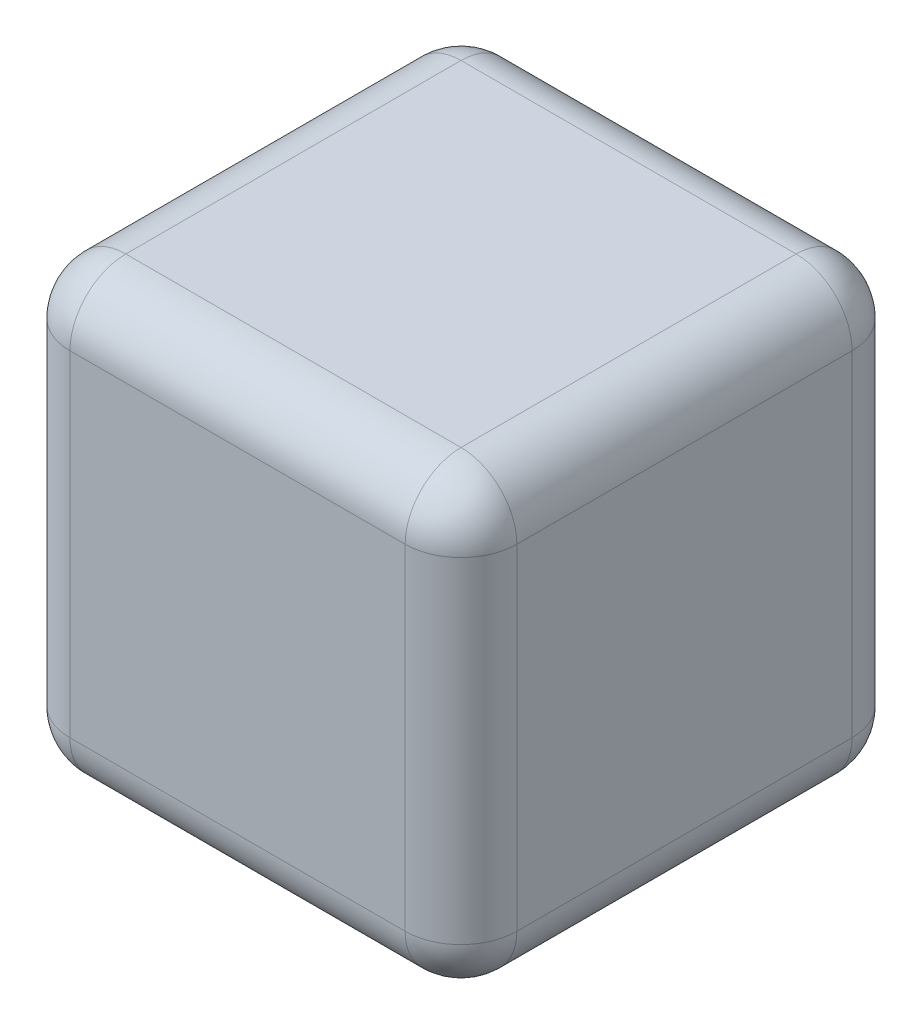
ISO-10303-21;
HEADER;
FILE_DESCRIPTION(('STEP AP214'),'2;1');
FILE_NAME('part.step','',(''),(''),'','','');
FILE_SCHEMA(('AUTOMOTIVE_DESIGN { 1 0 10303 214 1 1 1 1 }'));
ENDSEC;
DATA;
#1=APPLICATION_CONTEXT('core data for automotive mechanical design processes');
#2=APPLICATION_PROTOCOL_DEFINITION('international standard','automotive_design',2000,#1);
#3=PRODUCT_CONTEXT('',#1,'mechanical');
#4=PRODUCT('Part','Part','',(#3));
#5=PRODUCT_RELATED_PRODUCT_CATEGORY('part','',(#4));
#6=PRODUCT_DEFINITION_FORMATION('','',#4);
#7=PRODUCT_DEFINITION_CONTEXT('part definition',#1,'design');
#8=PRODUCT_DEFINITION('design','',#6,#7);
#9=PRODUCT_DEFINITION_SHAPE('','',#8);
#10=(LENGTH_UNIT() NAMED_UNIT(*) SI_UNIT(.MILLI.,.METRE.));
#11=(NAMED_UNIT(*) PLANE_ANGLE_UNIT() SI_UNIT($,.RADIAN.));
#12=(NAMED_UNIT(*) SI_UNIT($,.STERADIAN.) SOLID_ANGLE_UNIT());
#13=UNCERTAINTY_MEASURE_WITH_UNIT(LENGTH_MEASURE(1.E-05),#10,'distance_accuracy_value','');
#14=(GEOMETRIC_REPRESENTATION_CONTEXT(3) GLOBAL_UNCERTAINTY_ASSIGNED_CONTEXT((#13)) GLOBAL_UNIT_ASSIGNED_CONTEXT((#10,
#11,#12)) REPRESENTATION_CONTEXT('',''));
#15=CARTESIAN_POINT('',(0.,0.,0.));
#16=DIRECTION('',(0.,0.,1.));
#17=DIRECTION('',(1.,0.,0.));
#18=AXIS2_PLACEMENT_3D('',#15,#16,#17);
#19=CARTESIAN_POINT('',(40.,80.,-40.));
#20=DIRECTION('',(-1.,0.,0.));
#21=DIRECTION('',(0.,0.,1.));
#22=AXIS2_PLACEMENT_3D('',#19,#20,#21);
#23=PLANE('',#22);
#24=DIRECTION('',(0.,-1.,0.));
#25=VECTOR('',#24,1.);
#26=CARTESIAN_POINT('',(40.,80.,-30.));
#27=LINE('',#26,#25);
#28=CARTESIAN_POINT('',(40.,9.99999999999999,-30.));
#29=VERTEX_POINT('',#28);
#30=CARTESIAN_POINT('',(40.,70.,-30.));
#31=VERTEX_POINT('',#30);
#32=EDGE_CURVE('E262',#29,#31,#27,.F.);
#33=ORIENTED_EDGE('',*,*,#32,.T.);
#34=DIRECTION('',(0.,0.,-1.));
#35=VECTOR('',#34,1.);
#36=CARTESIAN_POINT('',(40.,70.,40.));
#37=LINE('',#36,#35);
#38=CARTESIAN_POINT('',(40.,70.,30.));
#39=VERTEX_POINT('',#38);
#40=EDGE_CURVE('E264',#31,#39,#37,.F.);
#41=ORIENTED_EDGE('',*,*,#40,.T.);
#42=DIRECTION('',(0.,-1.,0.));
#43=VECTOR('',#42,1.);
#44=CARTESIAN_POINT('',(40.,80.,30.));
#45=LINE('',#44,#43);
#46=CARTESIAN_POINT('',(40.,9.99999999999999,30.));
#47=VERTEX_POINT('',#46);
#48=EDGE_CURVE('E258',#39,#47,#45,.T.);
#49=ORIENTED_EDGE('',*,*,#48,.T.);
#50=DIRECTION('',(0.,0.,-1.));
#51=VECTOR('',#50,1.);
#52=CARTESIAN_POINT('',(40.,9.99999999999999,-40.));
#53=LINE('',#52,#51);
#54=EDGE_CURVE('E260',#47,#29,#53,.T.);
#55=ORIENTED_EDGE('',*,*,#54,.T.);
#56=EDGE_LOOP('',(#33,#41,#49,#55));
#57=FACE_BOUND('',#56,.T.);
#58=ADVANCED_FACE('F36',(#57),#23,.F.);
#59=CARTESIAN_POINT('',(-40.,80.,-40.));
#60=DIRECTION('',(0.,0.,1.));
#61=DIRECTION('',(1.,0.,0.));
#62=AXIS2_PLACEMENT_3D('',#59,#60,#61);
#63=PLANE('',#62);
#64=DIRECTION('',(-1.,0.,0.));
#65=VECTOR('',#64,1.);
#66=CARTESIAN_POINT('',(40.,70.,-40.));
#67=LINE('',#66,#65);
#68=CARTESIAN_POINT('',(-30.,70.,-40.));
#69=VERTEX_POINT('',#68);
#70=CARTESIAN_POINT('',(30.,70.,-40.));
#71=VERTEX_POINT('',#70);
#72=EDGE_CURVE('E236',#69,#71,#67,.F.);
#73=ORIENTED_EDGE('',*,*,#72,.T.);
#74=DIRECTION('',(0.,-1.,0.));
#75=VECTOR('',#74,1.);
#76=CARTESIAN_POINT('',(30.,80.,-40.));
#77=LINE('',#76,#75);
#78=CARTESIAN_POINT('',(30.,9.99999999999999,-40.));
#79=VERTEX_POINT('',#78);
#80=EDGE_CURVE('E229',#71,#79,#77,.T.);
#81=ORIENTED_EDGE('',*,*,#80,.T.);
#82=DIRECTION('',(-1.,0.,0.));
#83=VECTOR('',#82,1.);
#84=CARTESIAN_POINT('',(-40.,9.99999999999999,-40.));
#85=LINE('',#84,#83);
#86=CARTESIAN_POINT('',(-30.,9.99999999999999,-40.));
#87=VERTEX_POINT('',#86);
#88=EDGE_CURVE('E245',#79,#87,#85,.T.);
#89=ORIENTED_EDGE('',*,*,#88,.T.);
#90=DIRECTION('',(0.,-1.,0.));
#91=VECTOR('',#90,1.);
#92=CARTESIAN_POINT('',(-30.,80.,-40.));
#93=LINE('',#92,#91);
#94=EDGE_CURVE('E241',#87,#69,#93,.F.);
#95=ORIENTED_EDGE('',*,*,#94,.T.);
#96=EDGE_LOOP('',(#73,#81,#89,#95));
#97=FACE_BOUND('',#96,.T.);
#98=ADVANCED_FACE('F239',(#97),#63,.F.);
#99=CARTESIAN_POINT('',(-40.,80.,-40.));
#100=DIRECTION('',(1.,0.,0.));
#101=DIRECTION('',(0.,0.,-1.));
#102=AXIS2_PLACEMENT_3D('',#99,#100,#101);
#103=PLANE('',#102);
#104=DIRECTION('',(0.,0.,1.));
#105=VECTOR('',#104,1.);
#106=CARTESIAN_POINT('',(-40.,70.,-40.));
#107=LINE('',#106,#105);
#108=CARTESIAN_POINT('',(-40.,70.,30.));
#109=VERTEX_POINT('',#108);
#110=CARTESIAN_POINT('',(-40.,70.,-30.));
#111=VERTEX_POINT('',#110);
#112=EDGE_CURVE('E156',#109,#111,#107,.F.);
#113=ORIENTED_EDGE('',*,*,#112,.T.);
#114=DIRECTION('',(0.,-1.,0.));
#115=VECTOR('',#114,1.);
#116=CARTESIAN_POINT('',(-40.,80.,-30.));
#117=LINE('',#116,#115);
#118=CARTESIAN_POINT('',(-40.,9.99999999999999,-30.));
#119=VERTEX_POINT('',#118);
#120=EDGE_CURVE('E272',#111,#119,#117,.T.);
#121=ORIENTED_EDGE('',*,*,#120,.T.);
#122=DIRECTION('',(0.,0.,1.));
#123=VECTOR('',#122,1.);
#124=CARTESIAN_POINT('',(-40.,9.99999999999999,-40.));
#125=LINE('',#124,#123);
#126=CARTESIAN_POINT('',(-40.,9.99999999999999,30.));
#127=VERTEX_POINT('',#126);
#128=EDGE_CURVE('E269',#119,#127,#125,.T.);
#129=ORIENTED_EDGE('',*,*,#128,.T.);
#130=DIRECTION('',(0.,-1.,0.));
#131=VECTOR('',#130,1.);
#132=CARTESIAN_POINT('',(-40.,80.,30.));
#133=LINE('',#132,#131);
#134=EDGE_CURVE('E267',#127,#109,#133,.F.);
#135=ORIENTED_EDGE('',*,*,#134,.T.);
#136=EDGE_LOOP('',(#113,#121,#129,#135));
#137=FACE_BOUND('',#136,.T.);
#138=ADVANCED_FACE('F325',(#137),#103,.F.);
#139=CARTESIAN_POINT('',(-40.,80.,40.));
#140=DIRECTION('',(0.,0.,-1.));
#141=DIRECTION('',(-1.,0.,0.));
#142=AXIS2_PLACEMENT_3D('',#139,#140,#141);
#143=PLANE('',#142);
#144=DIRECTION('',(1.,0.,0.));
#145=VECTOR('',#144,1.);
#146=CARTESIAN_POINT('',(-40.,70.,40.));
#147=LINE('',#146,#145);
#148=CARTESIAN_POINT('',(30.,70.,40.));
#149=VERTEX_POINT('',#148);
#150=CARTESIAN_POINT('',(-30.,70.,40.));
#151=VERTEX_POINT('',#150);
#152=EDGE_CURVE('E51',#149,#151,#147,.F.);
#153=ORIENTED_EDGE('',*,*,#152,.T.);
#154=DIRECTION('',(0.,-1.,0.));
#155=VECTOR('',#154,1.);
#156=CARTESIAN_POINT('',(-30.,80.,40.));
#157=LINE('',#156,#155);
#158=CARTESIAN_POINT('',(-30.,9.99999999999999,40.));
#159=VERTEX_POINT('',#158);
#160=EDGE_CURVE('E201',#151,#159,#157,.T.);
#161=ORIENTED_EDGE('',*,*,#160,.T.);
#162=DIRECTION('',(1.,0.,0.));
#163=VECTOR('',#162,1.);
#164=CARTESIAN_POINT('',(-40.,9.99999999999999,40.));
#165=LINE('',#164,#163);
#166=CARTESIAN_POINT('',(30.,9.99999999999999,40.));
#167=VERTEX_POINT('',#166);
#168=EDGE_CURVE('E275',#159,#167,#165,.T.);
#169=ORIENTED_EDGE('',*,*,#168,.T.);
#170=DIRECTION('',(0.,-1.,0.));
#171=VECTOR('',#170,1.);
#172=CARTESIAN_POINT('',(30.,80.,40.));
#173=LINE('',#172,#171);
#174=EDGE_CURVE('E56',#167,#149,#173,.F.);
#175=ORIENTED_EDGE('',*,*,#174,.T.);
#176=EDGE_LOOP('',(#153,#161,#169,#175));
#177=FACE_BOUND('',#176,.T.);
#178=ADVANCED_FACE('F278',(#177),#143,.F.);
#179=CARTESIAN_POINT('',(0.,80.,0.));
#180=DIRECTION('',(0.,1.,0.));
#181=DIRECTION('',(0.,0.,1.));
#182=AXIS2_PLACEMENT_3D('',#179,#180,#181);
#183=PLANE('',#182);
#184=DIRECTION('',(0.,0.,-1.));
#185=VECTOR('',#184,1.);
#186=CARTESIAN_POINT('',(30.,80.,-40.));
#187=LINE('',#186,#185);
#188=CARTESIAN_POINT('',(30.,80.,30.));
#189=VERTEX_POINT('',#188);
#190=CARTESIAN_POINT('',(30.,80.,-30.));
#191=VERTEX_POINT('',#190);
#192=EDGE_CURVE('E134',#189,#191,#187,.T.);
#193=ORIENTED_EDGE('',*,*,#192,.T.);
#194=DIRECTION('',(-1.,0.,0.));
#195=VECTOR('',#194,1.);
#196=CARTESIAN_POINT('',(-40.,80.,-30.));
#197=LINE('',#196,#195);
#198=CARTESIAN_POINT('',(-30.,80.,-30.));
#199=VERTEX_POINT('',#198);
#200=EDGE_CURVE('E130',#191,#199,#197,.T.);
#201=ORIENTED_EDGE('',*,*,#200,.T.);
#202=DIRECTION('',(0.,0.,1.));
#203=VECTOR('',#202,1.);
#204=CARTESIAN_POINT('',(-30.,80.,40.));
#205=LINE('',#204,#203);
#206=CARTESIAN_POINT('',(-30.,80.,30.));
#207=VERTEX_POINT('',#206);
#208=EDGE_CURVE('E124',#199,#207,#205,.T.);
#209=ORIENTED_EDGE('',*,*,#208,.T.);
#210=DIRECTION('',(1.,0.,0.));
#211=VECTOR('',#210,1.);
#212=CARTESIAN_POINT('',(40.,80.,30.));
#213=LINE('',#212,#211);
#214=EDGE_CURVE('E127',#207,#189,#213,.T.);
#215=ORIENTED_EDGE('',*,*,#214,.T.);
#216=EDGE_LOOP('',(#193,#201,#209,#215));
#217=FACE_BOUND('',#216,.T.);
#218=ADVANCED_FACE('F126',(#217),#183,.T.);
#219=CARTESIAN_POINT('',(0.,0.,0.));
#220=DIRECTION('',(0.,1.,0.));
#221=DIRECTION('',(0.,0.,1.));
#222=AXIS2_PLACEMENT_3D('',#219,#220,#221);
#223=PLANE('',#222);
#224=DIRECTION('',(0.,0.,1.));
#225=VECTOR('',#224,1.);
#226=CARTESIAN_POINT('',(-30.,0.,0.));
#227=LINE('',#226,#225);
#228=CARTESIAN_POINT('',(-30.,0.,30.));
#229=VERTEX_POINT('',#228);
#230=CARTESIAN_POINT('',(-30.,0.,-30.));
#231=VERTEX_POINT('',#230);
#232=EDGE_CURVE('E251',#229,#231,#227,.F.);
#233=ORIENTED_EDGE('',*,*,#232,.T.);
#234=DIRECTION('',(-1.,0.,0.));
#235=VECTOR('',#234,1.);
#236=CARTESIAN_POINT('',(0.,0.,-30.));
#237=LINE('',#236,#235);
#238=CARTESIAN_POINT('',(30.,0.,-30.));
#239=VERTEX_POINT('',#238);
#240=EDGE_CURVE('E255',#231,#239,#237,.F.);
#241=ORIENTED_EDGE('',*,*,#240,.T.);
#242=DIRECTION('',(0.,0.,-1.));
#243=VECTOR('',#242,1.);
#244=CARTESIAN_POINT('',(30.,0.,0.));
#245=LINE('',#244,#243);
#246=CARTESIAN_POINT('',(30.,0.,30.));
#247=VERTEX_POINT('',#246);
#248=EDGE_CURVE('E253',#239,#247,#245,.F.);
#249=ORIENTED_EDGE('',*,*,#248,.T.);
#250=DIRECTION('',(1.,0.,0.));
#251=VECTOR('',#250,1.);
#252=CARTESIAN_POINT('',(0.,0.,30.));
#253=LINE('',#252,#251);
#254=EDGE_CURVE('E235',#247,#229,#253,.F.);
#255=ORIENTED_EDGE('',*,*,#254,.T.);
#256=EDGE_LOOP('',(#233,#241,#249,#255));
#257=FACE_BOUND('',#256,.T.);
#258=CARTESIAN_POINT('',(0.,0.,0.));
#259=DIRECTION('',(0.,1.,0.));
#260=DIRECTION('',(0.,0.,1.));
#261=AXIS2_PLACEMENT_3D('',#258,#259,#260);
#262=CIRCLE('',#261,5.);
#263=CARTESIAN_POINT('',(0.,0.,5.));
#264=VERTEX_POINT('',#263);
#265=EDGE_CURVE('E145',#264,#264,#262,.F.);
#266=ORIENTED_EDGE('',*,*,#265,.F.);
#267=EDGE_LOOP('',(#266));
#268=FACE_BOUND('',#267,.T.);
#269=ADVANCED_FACE('F306',(#257,#268),#223,.F.);
#270=CARTESIAN_POINT('',(0.,-20.,0.));
#271=DIRECTION('',(0.,1.,0.));
#272=DIRECTION('',(0.,0.,1.));
#273=AXIS2_PLACEMENT_3D('',#270,#271,#272);
#274=CYLINDRICAL_SURFACE('',#273,5.);
#275=CARTESIAN_POINT('',(0.,-18.,0.));
#276=DIRECTION('',(0.,-1.,0.));
#277=DIRECTION('',(0.,0.,-1.));
#278=AXIS2_PLACEMENT_3D('',#275,#276,#277);
#279=CIRCLE('',#278,5.);
#280=CARTESIAN_POINT('',(0.,-18.,-5.));
#281=VERTEX_POINT('',#280);
#282=EDGE_CURVE('E11',#281,#281,#279,.F.);
#283=ORIENTED_EDGE('',*,*,#282,.T.);
#284=EDGE_LOOP('',(#283));
#285=FACE_BOUND('',#284,.T.);
#286=ORIENTED_EDGE('',*,*,#265,.T.);
#287=EDGE_LOOP('',(#286));
#288=FACE_BOUND('',#287,.T.);
#289=ADVANCED_FACE('F304',(#285,#288),#274,.T.);
#290=CARTESIAN_POINT('',(0.,-20.,0.));
#291=DIRECTION('',(0.,-1.,0.));
#292=DIRECTION('',(0.,0.,-1.));
#293=AXIS2_PLACEMENT_3D('',#290,#291,#292);
#294=PLANE('',#293);
#295=CARTESIAN_POINT('',(0.,-20.,0.));
#296=DIRECTION('',(0.,-1.,0.));
#297=DIRECTION('',(0.,0.,-1.));
#298=AXIS2_PLACEMENT_3D('',#295,#296,#297);
#299=CIRCLE('',#298,3.);
#300=CARTESIAN_POINT('',(0.,-20.,-3.));
#301=VERTEX_POINT('',#300);
#302=EDGE_CURVE('E44',#301,#301,#299,.T.);
#303=ORIENTED_EDGE('',*,*,#302,.T.);
#304=EDGE_LOOP('',(#303));
#305=FACE_BOUND('',#304,.T.);
#306=ADVANCED_FACE('F314',(#305),#294,.T.);
#307=CARTESIAN_POINT('',(-40.,9.99999999999999,30.));
#308=DIRECTION('',(1.,0.,0.));
#309=DIRECTION('',(0.,0.,-1.));
#310=AXIS2_PLACEMENT_3D('',#307,#308,#309);
#311=CYLINDRICAL_SURFACE('',#310,10.);
#312=CARTESIAN_POINT('',(30.,9.99999999999999,30.));
#313=DIRECTION('',(1.,0.,0.));
#314=DIRECTION('',(0.,1.,0.));
#315=AXIS2_PLACEMENT_3D('',#312,#313,#314);
#316=CIRCLE('',#315,10.);
#317=EDGE_CURVE('E198',#167,#247,#316,.T.);
#318=ORIENTED_EDGE('',*,*,#317,.F.);
#319=ORIENTED_EDGE('',*,*,#168,.F.);
#320=CARTESIAN_POINT('',(-30.,10.,30.));
#321=DIRECTION('',(-1.,0.,0.));
#322=DIRECTION('',(0.,0.,1.));
#323=AXIS2_PLACEMENT_3D('',#320,#321,#322);
#324=CIRCLE('',#323,10.);
#325=EDGE_CURVE('E195',#229,#159,#324,.T.);
#326=ORIENTED_EDGE('',*,*,#325,.F.);
#327=ORIENTED_EDGE('',*,*,#254,.F.);
#328=EDGE_LOOP('',(#318,#319,#326,#327));
#329=FACE_BOUND('',#328,.T.);
#330=ADVANCED_FACE('F283',(#329),#311,.T.);
#331=CARTESIAN_POINT('',(30.,10.,30.));
#332=DIRECTION('',(0.,0.,1.));
#333=DIRECTION('',(1.,0.,0.));
#334=AXIS2_PLACEMENT_3D('',#331,#332,#333);
#335=SPHERICAL_SURFACE('',#334,10.);
#336=CARTESIAN_POINT('',(30.,9.99999999999999,30.));
#337=DIRECTION('',(0.,-1.,0.));
#338=DIRECTION('',(0.,0.,-1.));
#339=AXIS2_PLACEMENT_3D('',#336,#337,#338);
#340=CIRCLE('',#339,10.);
#341=EDGE_CURVE('E189',#167,#47,#340,.F.);
#342=ORIENTED_EDGE('',*,*,#341,.F.);
#343=ORIENTED_EDGE('',*,*,#317,.T.);
#344=CARTESIAN_POINT('',(30.,10.,30.));
#345=DIRECTION('',(0.,0.,1.));
#346=DIRECTION('',(1.,0.,0.));
#347=AXIS2_PLACEMENT_3D('',#344,#345,#346);
#348=CIRCLE('',#347,10.);
#349=EDGE_CURVE('E192',#47,#247,#348,.F.);
#350=ORIENTED_EDGE('',*,*,#349,.F.);
#351=EDGE_LOOP('',(#342,#343,#350));
#352=FACE_BOUND('',#351,.T.);
#353=ADVANCED_FACE('F286',(#352),#335,.T.);
#354=CARTESIAN_POINT('',(-30.,10.,30.));
#355=DIRECTION('',(0.,0.,1.));
#356=DIRECTION('',(1.,0.,0.));
#357=AXIS2_PLACEMENT_3D('',#354,#355,#356);
#358=SPHERICAL_SURFACE('',#357,10.);
#359=CARTESIAN_POINT('',(-30.,9.99999999999999,30.));
#360=DIRECTION('',(0.,0.,1.));
#361=DIRECTION('',(1.,0.,0.));
#362=AXIS2_PLACEMENT_3D('',#359,#360,#361);
#363=CIRCLE('',#362,10.);
#364=EDGE_CURVE('E184',#229,#127,#363,.F.);
#365=ORIENTED_EDGE('',*,*,#364,.F.);
#366=ORIENTED_EDGE('',*,*,#325,.T.);
#367=CARTESIAN_POINT('',(-30.,9.99999999999999,30.));
#368=DIRECTION('',(0.,-1.,0.));
#369=DIRECTION('',(0.,0.,-1.));
#370=AXIS2_PLACEMENT_3D('',#367,#368,#369);
#371=CIRCLE('',#370,10.);
#372=EDGE_CURVE('E187',#127,#159,#371,.F.);
#373=ORIENTED_EDGE('',*,*,#372,.F.);
#374=EDGE_LOOP('',(#365,#366,#373));
#375=FACE_BOUND('',#374,.T.);
#376=ADVANCED_FACE('F379',(#375),#358,.T.);
#377=CARTESIAN_POINT('',(30.,9.99999999999999,-40.));
#378=DIRECTION('',(0.,0.,-1.));
#379=DIRECTION('',(-1.,0.,0.));
#380=AXIS2_PLACEMENT_3D('',#377,#378,#379);
#381=CYLINDRICAL_SURFACE('',#380,10.);
#382=ORIENTED_EDGE('',*,*,#349,.T.);
#383=ORIENTED_EDGE('',*,*,#248,.F.);
#384=CARTESIAN_POINT('',(30.,9.99999999999999,-30.));
#385=DIRECTION('',(0.,0.,-1.));
#386=DIRECTION('',(-1.,0.,0.));
#387=AXIS2_PLACEMENT_3D('',#384,#385,#386);
#388=CIRCLE('',#387,10.);
#389=EDGE_CURVE('E179',#29,#239,#388,.T.);
#390=ORIENTED_EDGE('',*,*,#389,.F.);
#391=ORIENTED_EDGE('',*,*,#54,.F.);
#392=EDGE_LOOP('',(#382,#383,#390,#391));
#393=FACE_BOUND('',#392,.T.);
#394=ADVANCED_FACE('F376',(#393),#381,.T.);
#395=CARTESIAN_POINT('',(30.,80.,30.));
#396=DIRECTION('',(0.,-1.,0.));
#397=DIRECTION('',(0.,0.,-1.));
#398=AXIS2_PLACEMENT_3D('',#395,#396,#397);
#399=CYLINDRICAL_SURFACE('',#398,10.);
#400=ORIENTED_EDGE('',*,*,#341,.T.);
#401=ORIENTED_EDGE('',*,*,#48,.F.);
#402=CARTESIAN_POINT('',(30.,70.,30.));
#403=DIRECTION('',(0.,1.,0.));
#404=DIRECTION('',(0.,0.,1.));
#405=AXIS2_PLACEMENT_3D('',#402,#403,#404);
#406=CIRCLE('',#405,10.);
#407=EDGE_CURVE('E176',#149,#39,#406,.T.);
#408=ORIENTED_EDGE('',*,*,#407,.F.);
#409=ORIENTED_EDGE('',*,*,#174,.F.);
#410=EDGE_LOOP('',(#400,#401,#408,#409));
#411=FACE_BOUND('',#410,.T.);
#412=ADVANCED_FACE('F291',(#411),#399,.T.);
#413=CARTESIAN_POINT('',(0.,70.,30.));
#414=DIRECTION('',(-1.,0.,0.));
#415=DIRECTION('',(0.,0.,1.));
#416=AXIS2_PLACEMENT_3D('',#413,#414,#415);
#417=CYLINDRICAL_SURFACE('',#416,10.);
#418=CARTESIAN_POINT('',(-30.,70.,30.));
#419=DIRECTION('',(-1.,0.,0.));
#420=DIRECTION('',(0.,-1.,0.));
#421=AXIS2_PLACEMENT_3D('',#418,#419,#420);
#422=CIRCLE('',#421,10.);
#423=EDGE_CURVE('E140',#151,#207,#422,.T.);
#424=ORIENTED_EDGE('',*,*,#423,.F.);
#425=ORIENTED_EDGE('',*,*,#152,.F.);
#426=CARTESIAN_POINT('',(30.,70.,30.));
#427=DIRECTION('',(1.,0.,0.));
#428=DIRECTION('',(0.,0.,-1.));
#429=AXIS2_PLACEMENT_3D('',#426,#427,#428);
#430=CIRCLE('',#429,10.);
#431=EDGE_CURVE('E143',#189,#149,#430,.T.);
#432=ORIENTED_EDGE('',*,*,#431,.F.);
#433=ORIENTED_EDGE('',*,*,#214,.F.);
#434=EDGE_LOOP('',(#424,#425,#432,#433));
#435=FACE_BOUND('',#434,.T.);
#436=ADVANCED_FACE('F139',(#435),#417,.T.);
#437=CARTESIAN_POINT('',(-30.,80.,30.));
#438=DIRECTION('',(0.,-1.,0.));
#439=DIRECTION('',(0.,0.,-1.));
#440=AXIS2_PLACEMENT_3D('',#437,#438,#439);
#441=CYLINDRICAL_SURFACE('',#440,10.);
#442=ORIENTED_EDGE('',*,*,#372,.T.);
#443=ORIENTED_EDGE('',*,*,#160,.F.);
#444=CARTESIAN_POINT('',(-30.,70.,30.));
#445=DIRECTION('',(0.,1.,0.));
#446=DIRECTION('',(0.,0.,1.));
#447=AXIS2_PLACEMENT_3D('',#444,#445,#446);
#448=CIRCLE('',#447,10.);
#449=EDGE_CURVE('E153',#109,#151,#448,.T.);
#450=ORIENTED_EDGE('',*,*,#449,.F.);
#451=ORIENTED_EDGE('',*,*,#134,.F.);
#452=EDGE_LOOP('',(#442,#443,#450,#451));
#453=FACE_BOUND('',#452,.T.);
#454=ADVANCED_FACE('F367',(#453),#441,.T.);
#455=CARTESIAN_POINT('',(-30.,9.99999999999999,-40.));
#456=DIRECTION('',(0.,0.,1.));
#457=DIRECTION('',(1.,0.,0.));
#458=AXIS2_PLACEMENT_3D('',#455,#456,#457);
#459=CYLINDRICAL_SURFACE('',#458,10.);
#460=ORIENTED_EDGE('',*,*,#364,.T.);
#461=ORIENTED_EDGE('',*,*,#128,.F.);
#462=CARTESIAN_POINT('',(-30.,10.,-30.));
#463=DIRECTION('',(0.,0.,-1.));
#464=DIRECTION('',(-1.,0.,0.));
#465=AXIS2_PLACEMENT_3D('',#462,#463,#464);
#466=CIRCLE('',#465,10.);
#467=EDGE_CURVE('E171',#231,#119,#466,.T.);
#468=ORIENTED_EDGE('',*,*,#467,.F.);
#469=ORIENTED_EDGE('',*,*,#232,.F.);
#470=EDGE_LOOP('',(#460,#461,#468,#469));
#471=FACE_BOUND('',#470,.T.);
#472=ADVANCED_FACE('F363',(#471),#459,.T.);
#473=CARTESIAN_POINT('',(-40.,9.99999999999999,-30.));
#474=DIRECTION('',(-1.,0.,0.));
#475=DIRECTION('',(0.,0.,1.));
#476=AXIS2_PLACEMENT_3D('',#473,#474,#475);
#477=CYLINDRICAL_SURFACE('',#476,10.);
#478=CARTESIAN_POINT('',(30.,10.,-30.));
#479=DIRECTION('',(1.,0.,0.));
#480=DIRECTION('',(0.,0.,-1.));
#481=AXIS2_PLACEMENT_3D('',#478,#479,#480);
#482=CIRCLE('',#481,10.);
#483=EDGE_CURVE('E181',#239,#79,#482,.T.);
#484=ORIENTED_EDGE('',*,*,#483,.F.);
#485=ORIENTED_EDGE('',*,*,#240,.F.);
#486=CARTESIAN_POINT('',(-30.,9.99999999999999,-30.));
#487=DIRECTION('',(-1.,0.,0.));
#488=DIRECTION('',(0.,0.,1.));
#489=AXIS2_PLACEMENT_3D('',#486,#487,#488);
#490=CIRCLE('',#489,10.);
#491=EDGE_CURVE('E168',#87,#231,#490,.T.);
#492=ORIENTED_EDGE('',*,*,#491,.F.);
#493=ORIENTED_EDGE('',*,*,#88,.F.);
#494=EDGE_LOOP('',(#484,#485,#492,#493));
#495=FACE_BOUND('',#494,.T.);
#496=ADVANCED_FACE('F359',(#495),#477,.T.);
#497=CARTESIAN_POINT('',(30.,10.,-30.));
#498=DIRECTION('',(0.,0.,1.));
#499=DIRECTION('',(1.,0.,0.));
#500=AXIS2_PLACEMENT_3D('',#497,#498,#499);
#501=SPHERICAL_SURFACE('',#500,10.);
#502=ORIENTED_EDGE('',*,*,#389,.T.);
#503=ORIENTED_EDGE('',*,*,#483,.T.);
#504=CARTESIAN_POINT('',(30.,9.99999999999999,-30.));
#505=DIRECTION('',(0.,-1.,0.));
#506=DIRECTION('',(0.,0.,-1.));
#507=AXIS2_PLACEMENT_3D('',#504,#505,#506);
#508=CIRCLE('',#507,10.);
#509=EDGE_CURVE('E160',#29,#79,#508,.F.);
#510=ORIENTED_EDGE('',*,*,#509,.F.);
#511=EDGE_LOOP('',(#502,#503,#510));
#512=FACE_BOUND('',#511,.T.);
#513=ADVANCED_FACE('F356',(#512),#501,.T.);
#514=CARTESIAN_POINT('',(30.,70.,30.));
#515=DIRECTION('',(0.,0.,1.));
#516=DIRECTION('',(1.,0.,0.));
#517=AXIS2_PLACEMENT_3D('',#514,#515,#516);
#518=SPHERICAL_SURFACE('',#517,10.);
#519=ORIENTED_EDGE('',*,*,#431,.T.);
#520=ORIENTED_EDGE('',*,*,#407,.T.);
#521=CARTESIAN_POINT('',(30.,70.,30.));
#522=DIRECTION('',(0.,0.,1.));
#523=DIRECTION('',(0.,-1.,0.));
#524=AXIS2_PLACEMENT_3D('',#521,#522,#523);
#525=CIRCLE('',#524,10.);
#526=EDGE_CURVE('E157',#189,#39,#525,.F.);
#527=ORIENTED_EDGE('',*,*,#526,.F.);
#528=EDGE_LOOP('',(#519,#520,#527));
#529=FACE_BOUND('',#528,.T.);
#530=ADVANCED_FACE('F293',(#529),#518,.T.);
#531=CARTESIAN_POINT('',(-30.,70.,30.));
#532=DIRECTION('',(0.,0.,1.));
#533=DIRECTION('',(1.,0.,0.));
#534=AXIS2_PLACEMENT_3D('',#531,#532,#533);
#535=SPHERICAL_SURFACE('',#534,10.);
#536=ORIENTED_EDGE('',*,*,#449,.T.);
#537=ORIENTED_EDGE('',*,*,#423,.T.);
#538=CARTESIAN_POINT('',(-30.,70.,30.));
#539=DIRECTION('',(0.,0.,1.));
#540=DIRECTION('',(1.,0.,0.));
#541=AXIS2_PLACEMENT_3D('',#538,#539,#540);
#542=CIRCLE('',#541,10.);
#543=EDGE_CURVE('E150',#109,#207,#542,.F.);
#544=ORIENTED_EDGE('',*,*,#543,.F.);
#545=EDGE_LOOP('',(#536,#537,#544));
#546=FACE_BOUND('',#545,.T.);
#547=ADVANCED_FACE('F149',(#546),#535,.T.);
#548=CARTESIAN_POINT('',(-30.,10.,-30.));
#549=DIRECTION('',(0.,0.,1.));
#550=DIRECTION('',(1.,0.,0.));
#551=AXIS2_PLACEMENT_3D('',#548,#549,#550);
#552=SPHERICAL_SURFACE('',#551,10.);
#553=ORIENTED_EDGE('',*,*,#491,.T.);
#554=ORIENTED_EDGE('',*,*,#467,.T.);
#555=CARTESIAN_POINT('',(-30.,9.99999999999999,-30.));
#556=DIRECTION('',(0.,-1.,0.));
#557=DIRECTION('',(0.,0.,-1.));
#558=AXIS2_PLACEMENT_3D('',#555,#556,#557);
#559=CIRCLE('',#558,10.);
#560=EDGE_CURVE('E158',#87,#119,#559,.F.);
#561=ORIENTED_EDGE('',*,*,#560,.F.);
#562=EDGE_LOOP('',(#553,#554,#561));
#563=FACE_BOUND('',#562,.T.);
#564=ADVANCED_FACE('F348',(#563),#552,.T.);
#565=CARTESIAN_POINT('',(30.,80.,-30.));
#566=DIRECTION('',(0.,-1.,0.));
#567=DIRECTION('',(0.,0.,-1.));
#568=AXIS2_PLACEMENT_3D('',#565,#566,#567);
#569=CYLINDRICAL_SURFACE('',#568,10.);
#570=ORIENTED_EDGE('',*,*,#509,.T.);
#571=ORIENTED_EDGE('',*,*,#80,.F.);
#572=CARTESIAN_POINT('',(30.,70.,-30.));
#573=DIRECTION('',(0.,1.,0.));
#574=DIRECTION('',(0.,0.,1.));
#575=AXIS2_PLACEMENT_3D('',#572,#573,#574);
#576=CIRCLE('',#575,10.);
#577=EDGE_CURVE('E162',#31,#71,#576,.T.);
#578=ORIENTED_EDGE('',*,*,#577,.F.);
#579=ORIENTED_EDGE('',*,*,#32,.F.);
#580=EDGE_LOOP('',(#570,#571,#578,#579));
#581=FACE_BOUND('',#580,.T.);
#582=ADVANCED_FACE('F231',(#581),#569,.T.);
#583=CARTESIAN_POINT('',(30.,70.,0.));
#584=DIRECTION('',(0.,0.,1.));
#585=DIRECTION('',(1.,0.,0.));
#586=AXIS2_PLACEMENT_3D('',#583,#584,#585);
#587=CYLINDRICAL_SURFACE('',#586,10.);
#588=ORIENTED_EDGE('',*,*,#526,.T.);
#589=ORIENTED_EDGE('',*,*,#40,.F.);
#590=CARTESIAN_POINT('',(30.,70.,-30.));
#591=DIRECTION('',(0.,0.,-1.));
#592=DIRECTION('',(-1.,0.,0.));
#593=AXIS2_PLACEMENT_3D('',#590,#591,#592);
#594=CIRCLE('',#593,10.);
#595=EDGE_CURVE('E218',#191,#31,#594,.T.);
#596=ORIENTED_EDGE('',*,*,#595,.F.);
#597=ORIENTED_EDGE('',*,*,#192,.F.);
#598=EDGE_LOOP('',(#588,#589,#596,#597));
#599=FACE_BOUND('',#598,.T.);
#600=ADVANCED_FACE('F297',(#599),#587,.T.);
#601=CARTESIAN_POINT('',(-30.,70.,0.));
#602=DIRECTION('',(0.,0.,-1.));
#603=DIRECTION('',(-1.,0.,0.));
#604=AXIS2_PLACEMENT_3D('',#601,#602,#603);
#605=CYLINDRICAL_SURFACE('',#604,10.);
#606=ORIENTED_EDGE('',*,*,#543,.T.);
#607=ORIENTED_EDGE('',*,*,#208,.F.);
#608=CARTESIAN_POINT('',(-30.,70.,-30.));
#609=DIRECTION('',(0.,0.,-1.));
#610=DIRECTION('',(-1.,0.,0.));
#611=AXIS2_PLACEMENT_3D('',#608,#609,#610);
#612=CIRCLE('',#611,10.);
#613=EDGE_CURVE('E215',#111,#199,#612,.T.);
#614=ORIENTED_EDGE('',*,*,#613,.F.);
#615=ORIENTED_EDGE('',*,*,#112,.F.);
#616=EDGE_LOOP('',(#606,#607,#614,#615));
#617=FACE_BOUND('',#616,.T.);
#618=ADVANCED_FACE('F155',(#617),#605,.T.);
#619=CARTESIAN_POINT('',(-30.,80.,-30.));
#620=DIRECTION('',(0.,-1.,0.));
#621=DIRECTION('',(0.,0.,-1.));
#622=AXIS2_PLACEMENT_3D('',#619,#620,#621);
#623=CYLINDRICAL_SURFACE('',#622,10.);
#624=ORIENTED_EDGE('',*,*,#560,.T.);
#625=ORIENTED_EDGE('',*,*,#120,.F.);
#626=CARTESIAN_POINT('',(-30.,70.,-30.));
#627=DIRECTION('',(0.,1.,0.));
#628=DIRECTION('',(0.,0.,1.));
#629=AXIS2_PLACEMENT_3D('',#626,#627,#628);
#630=CIRCLE('',#629,10.);
#631=EDGE_CURVE('E212',#69,#111,#630,.T.);
#632=ORIENTED_EDGE('',*,*,#631,.F.);
#633=ORIENTED_EDGE('',*,*,#94,.F.);
#634=EDGE_LOOP('',(#624,#625,#632,#633));
#635=FACE_BOUND('',#634,.T.);
#636=ADVANCED_FACE('F338',(#635),#623,.T.);
#637=CARTESIAN_POINT('',(30.,70.,-30.));
#638=DIRECTION('',(0.,0.,1.));
#639=DIRECTION('',(1.,0.,0.));
#640=AXIS2_PLACEMENT_3D('',#637,#638,#639);
#641=SPHERICAL_SURFACE('',#640,10.);
#642=ORIENTED_EDGE('',*,*,#595,.T.);
#643=ORIENTED_EDGE('',*,*,#577,.T.);
#644=CARTESIAN_POINT('',(30.,70.,-30.));
#645=DIRECTION('',(1.,0.,0.));
#646=DIRECTION('',(0.,1.,0.));
#647=AXIS2_PLACEMENT_3D('',#644,#645,#646);
#648=CIRCLE('',#647,10.);
#649=EDGE_CURVE('E210',#191,#71,#648,.F.);
#650=ORIENTED_EDGE('',*,*,#649,.F.);
#651=EDGE_LOOP('',(#642,#643,#650));
#652=FACE_BOUND('',#651,.T.);
#653=ADVANCED_FACE('F225',(#652),#641,.T.);
#654=CARTESIAN_POINT('',(-30.,70.,-30.));
#655=DIRECTION('',(0.,0.,1.));
#656=DIRECTION('',(1.,0.,0.));
#657=AXIS2_PLACEMENT_3D('',#654,#655,#656);
#658=SPHERICAL_SURFACE('',#657,10.);
#659=ORIENTED_EDGE('',*,*,#631,.T.);
#660=ORIENTED_EDGE('',*,*,#613,.T.);
#661=CARTESIAN_POINT('',(-30.,70.,-30.));
#662=DIRECTION('',(-1.,0.,0.));
#663=DIRECTION('',(0.,0.,1.));
#664=AXIS2_PLACEMENT_3D('',#661,#662,#663);
#665=CIRCLE('',#664,10.);
#666=EDGE_CURVE('E208',#69,#199,#665,.F.);
#667=ORIENTED_EDGE('',*,*,#666,.F.);
#668=EDGE_LOOP('',(#659,#660,#667));
#669=FACE_BOUND('',#668,.T.);
#670=ADVANCED_FACE('F332',(#669),#658,.T.);
#671=CARTESIAN_POINT('',(0.,70.,-30.));
#672=DIRECTION('',(1.,0.,0.));
#673=DIRECTION('',(0.,0.,-1.));
#674=AXIS2_PLACEMENT_3D('',#671,#672,#673);
#675=CYLINDRICAL_SURFACE('',#674,10.);
#676=ORIENTED_EDGE('',*,*,#649,.T.);
#677=ORIENTED_EDGE('',*,*,#72,.F.);
#678=ORIENTED_EDGE('',*,*,#666,.T.);
#679=ORIENTED_EDGE('',*,*,#200,.F.);
#680=EDGE_LOOP('',(#676,#677,#678,#679));
#681=FACE_BOUND('',#680,.T.);
#682=ADVANCED_FACE('F329',(#681),#675,.T.);
#683=CARTESIAN_POINT('',(0.,-18.,0.));
#684=DIRECTION('',(0.,-1.,0.));
#685=DIRECTION('',(0.,0.,-1.));
#686=AXIS2_PLACEMENT_3D('',#683,#684,#685);
#687=TOROIDAL_SURFACE('',#686,3.,2.);
#688=ORIENTED_EDGE('',*,*,#282,.F.);
#689=EDGE_LOOP('',(#688));
#690=FACE_BOUND('',#689,.T.);
#691=ORIENTED_EDGE('',*,*,#302,.F.);
#692=EDGE_LOOP('',(#691));
#693=FACE_BOUND('',#692,.T.);
#694=ADVANCED_FACE('F38',(#690,#693),#687,.T.);
#695=CLOSED_SHELL('',(#58,#98,#138,#178,#218,#269,#289,#306,#330,#353,#376,#394,#412,#436,#454,
#472,#496,#513,#530,#547,#564,#582,#600,#618,#636,#653,#670,#682,#694));
#696=MANIFOLD_SOLID_BREP('B2',#695);
#697=ADVANCED_BREP_SHAPE_REPRESENTATION('',(#18,#696),#14);
#698=SHAPE_DEFINITION_REPRESENTATION(#9,#697);
ENDSEC;
END-ISO-10303-21;
